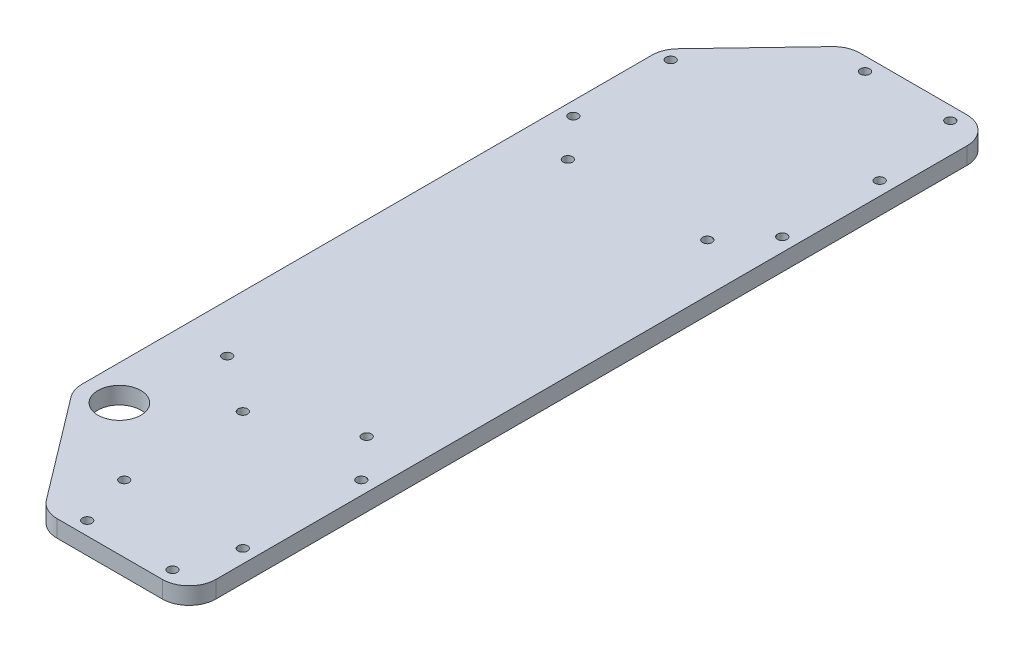
ISO-10303-21;
HEADER;
FILE_DESCRIPTION(('STEP AP214'),'2;1');
FILE_NAME('part.step','',(''),(''),'','','');
FILE_SCHEMA(('AUTOMOTIVE_DESIGN { 1 0 10303 214 1 1 1 1 }'));
ENDSEC;
DATA;
#1=APPLICATION_CONTEXT('core data for automotive mechanical design processes');
#2=APPLICATION_PROTOCOL_DEFINITION('international standard','automotive_design',2000,#1);
#3=PRODUCT_CONTEXT('',#1,'mechanical');
#4=PRODUCT('Part','Part','',(#3));
#5=PRODUCT_RELATED_PRODUCT_CATEGORY('part','',(#4));
#6=PRODUCT_DEFINITION_FORMATION('','',#4);
#7=PRODUCT_DEFINITION_CONTEXT('part definition',#1,'design');
#8=PRODUCT_DEFINITION('design','',#6,#7);
#9=PRODUCT_DEFINITION_SHAPE('','',#8);
#10=(LENGTH_UNIT() NAMED_UNIT(*) SI_UNIT(.MILLI.,.METRE.));
#11=(NAMED_UNIT(*) PLANE_ANGLE_UNIT() SI_UNIT($,.RADIAN.));
#12=(NAMED_UNIT(*) SI_UNIT($,.STERADIAN.) SOLID_ANGLE_UNIT());
#13=UNCERTAINTY_MEASURE_WITH_UNIT(LENGTH_MEASURE(1.E-05),#10,'distance_accuracy_value','');
#14=(GEOMETRIC_REPRESENTATION_CONTEXT(3) GLOBAL_UNCERTAINTY_ASSIGNED_CONTEXT((#13)) GLOBAL_UNIT_ASSIGNED_CONTEXT((#10,
#11,#12)) REPRESENTATION_CONTEXT('',''));
#15=CARTESIAN_POINT('',(0.,0.,0.));
#16=DIRECTION('',(0.,0.,1.));
#17=DIRECTION('',(1.,0.,0.));
#18=AXIS2_PLACEMENT_3D('',#15,#16,#17);
#19=CARTESIAN_POINT('',(0.,6.35,-300.));
#20=DIRECTION('',(0.,0.,-1.));
#21=DIRECTION('',(-1.,0.,0.));
#22=AXIS2_PLACEMENT_3D('',#19,#20,#21);
#23=PLANE('',#22);
#24=DIRECTION('',(1.,0.,0.));
#25=VECTOR('',#24,1.);
#26=CARTESIAN_POINT('',(0.,0.,-300.));
#27=LINE('',#26,#25);
#28=CARTESIAN_POINT('',(38.0848455550211,0.,-300.));
#29=VERTEX_POINT('',#28);
#30=CARTESIAN_POINT('',(78.,0.,-300.));
#31=VERTEX_POINT('',#30);
#32=EDGE_CURVE('E161',#29,#31,#27,.T.);
#33=ORIENTED_EDGE('',*,*,#32,.F.);
#34=DIRECTION('',(0.,-1.,0.));
#35=VECTOR('',#34,1.);
#36=CARTESIAN_POINT('',(38.0848455550211,6.35,-300.));
#37=LINE('',#36,#35);
#38=CARTESIAN_POINT('',(38.0848455550211,6.35,-300.));
#39=VERTEX_POINT('',#38);
#40=EDGE_CURVE('E136',#29,#39,#37,.F.);
#41=ORIENTED_EDGE('',*,*,#40,.T.);
#42=DIRECTION('',(1.,0.,0.));
#43=VECTOR('',#42,1.);
#44=CARTESIAN_POINT('',(0.,6.35,-300.));
#45=LINE('',#44,#43);
#46=CARTESIAN_POINT('',(78.,6.35,-300.));
#47=VERTEX_POINT('',#46);
#48=EDGE_CURVE('E446',#39,#47,#45,.T.);
#49=ORIENTED_EDGE('',*,*,#48,.T.);
#50=DIRECTION('',(0.,-1.,0.));
#51=VECTOR('',#50,1.);
#52=CARTESIAN_POINT('',(78.,0.,-300.));
#53=LINE('',#52,#51);
#54=EDGE_CURVE('E142',#47,#31,#53,.T.);
#55=ORIENTED_EDGE('',*,*,#54,.T.);
#56=EDGE_LOOP('',(#33,#41,#49,#55));
#57=FACE_BOUND('',#56,.T.);
#58=ADVANCED_FACE('F40',(#57),#23,.T.);
#59=CARTESIAN_POINT('',(-132.104836842493,6.35,-125.851116018708));
#60=DIRECTION('',(0.724036688648535,0.,0.689761461297211));
#61=DIRECTION('',(0.689761461297211,0.,-0.724036688648535));
#62=AXIS2_PLACEMENT_3D('',#59,#60,#61);
#63=PLANE('',#62);
#64=DIRECTION('',(-0.689761461297211,0.,0.724036688648535));
#65=VECTOR('',#64,1.);
#66=CARTESIAN_POINT('',(-132.104836842493,6.35,-125.851116018708));
#67=LINE('',#66,#65);
#68=CARTESIAN_POINT('',(30.8444786685357,6.35,-296.897614612972));
#69=VERTEX_POINT('',#68);
#70=CARTESIAN_POINT('',(2.75963311351465,6.35,-267.417193166084));
#71=VERTEX_POINT('',#70);
#72=EDGE_CURVE('E152',#69,#71,#67,.T.);
#73=ORIENTED_EDGE('',*,*,#72,.F.);
#74=DIRECTION('',(0.,-1.,0.));
#75=VECTOR('',#74,1.);
#76=CARTESIAN_POINT('',(30.8444786685357,0.,-296.897614612972));
#77=LINE('',#76,#75);
#78=CARTESIAN_POINT('',(30.8444786685357,0.,-296.897614612972));
#79=VERTEX_POINT('',#78);
#80=EDGE_CURVE('E135',#69,#79,#77,.T.);
#81=ORIENTED_EDGE('',*,*,#80,.T.);
#82=DIRECTION('',(-0.689761461297211,0.,0.724036688648535));
#83=VECTOR('',#82,1.);
#84=CARTESIAN_POINT('',(-132.104836842493,0.,-125.851116018708));
#85=LINE('',#84,#83);
#86=CARTESIAN_POINT('',(2.75963311351465,0.,-267.417193166084));
#87=VERTEX_POINT('',#86);
#88=EDGE_CURVE('E149',#79,#87,#85,.T.);
#89=ORIENTED_EDGE('',*,*,#88,.T.);
#90=DIRECTION('',(0.,-1.,0.));
#91=VECTOR('',#90,1.);
#92=CARTESIAN_POINT('',(2.75963311351465,6.35,-267.417193166084));
#93=LINE('',#92,#91);
#94=EDGE_CURVE('E155',#87,#71,#93,.F.);
#95=ORIENTED_EDGE('',*,*,#94,.T.);
#96=EDGE_LOOP('',(#73,#81,#89,#95));
#97=FACE_BOUND('',#96,.T.);
#98=ADVANCED_FACE('F148',(#97),#63,.F.);
#99=CARTESIAN_POINT('',(0.,6.35,0.));
#100=DIRECTION('',(-1.,0.,0.));
#101=DIRECTION('',(0.,0.,1.));
#102=AXIS2_PLACEMENT_3D('',#99,#100,#101);
#103=PLANE('',#102);
#104=DIRECTION('',(0.,0.,-1.));
#105=VECTOR('',#104,1.);
#106=CARTESIAN_POINT('',(0.,6.35,0.));
#107=LINE('',#106,#105);
#108=CARTESIAN_POINT('',(0.,6.35,-47.9922495753838));
#109=VERTEX_POINT('',#108);
#110=CARTESIAN_POINT('',(0.,6.35,-260.519578553112));
#111=VERTEX_POINT('',#110);
#112=EDGE_CURVE('E267',#109,#111,#107,.T.);
#113=ORIENTED_EDGE('',*,*,#112,.T.);
#114=DIRECTION('',(0.,-1.,0.));
#115=VECTOR('',#114,1.);
#116=CARTESIAN_POINT('',(0.,0.,-260.519578553112));
#117=LINE('',#116,#115);
#118=CARTESIAN_POINT('',(0.,0.,-260.519578553112));
#119=VERTEX_POINT('',#118);
#120=EDGE_CURVE('E223',#111,#119,#117,.T.);
#121=ORIENTED_EDGE('',*,*,#120,.T.);
#122=DIRECTION('',(0.,0.,-1.));
#123=VECTOR('',#122,1.);
#124=CARTESIAN_POINT('',(0.,0.,0.));
#125=LINE('',#124,#123);
#126=CARTESIAN_POINT('',(0.,0.,-47.9922495753838));
#127=VERTEX_POINT('',#126);
#128=EDGE_CURVE('E160',#127,#119,#125,.T.);
#129=ORIENTED_EDGE('',*,*,#128,.F.);
#130=DIRECTION('',(0.,-1.,0.));
#131=VECTOR('',#130,1.);
#132=CARTESIAN_POINT('',(0.,6.35,-47.9922495753838));
#133=LINE('',#132,#131);
#134=EDGE_CURVE('E220',#127,#109,#133,.F.);
#135=ORIENTED_EDGE('',*,*,#134,.T.);
#136=EDGE_LOOP('',(#113,#121,#129,#135));
#137=FACE_BOUND('',#136,.T.);
#138=ADVANCED_FACE('F359',(#137),#103,.T.);
#139=CARTESIAN_POINT('',(21.481023492821,6.35,-16.267274626016));
#140=DIRECTION('',(-0.797203386490908,0.,0.603710825285937));
#141=DIRECTION('',(0.603710825285937,0.,0.797203386490908));
#142=AXIS2_PLACEMENT_3D('',#139,#140,#141);
#143=PLANE('',#142);
#144=DIRECTION('',(-0.603710825285937,0.,-0.797203386490908));
#145=VECTOR('',#144,1.);
#146=CARTESIAN_POINT('',(21.481023492821,0.,-16.267274626016));
#147=LINE('',#146,#145);
#148=CARTESIAN_POINT('',(30.7989582486396,0.,-3.96289174714063));
#149=VERTEX_POINT('',#148);
#150=CARTESIAN_POINT('',(2.02796613509092,0.,-41.9551413225245));
#151=VERTEX_POINT('',#150);
#152=EDGE_CURVE('E165',#149,#151,#147,.T.);
#153=ORIENTED_EDGE('',*,*,#152,.F.);
#154=DIRECTION('',(0.,-1.,0.));
#155=VECTOR('',#154,1.);
#156=CARTESIAN_POINT('',(30.7989582486396,6.35,-3.96289174714063));
#157=LINE('',#156,#155);
#158=CARTESIAN_POINT('',(30.7989582486396,6.35,-3.96289174714063));
#159=VERTEX_POINT('',#158);
#160=EDGE_CURVE('E11',#149,#159,#157,.F.);
#161=ORIENTED_EDGE('',*,*,#160,.T.);
#162=DIRECTION('',(-0.603710825285937,0.,-0.797203386490908));
#163=VECTOR('',#162,1.);
#164=CARTESIAN_POINT('',(21.481023492821,6.35,-16.267274626016));
#165=LINE('',#164,#163);
#166=CARTESIAN_POINT('',(2.02796613509092,6.35,-41.9551413225245));
#167=VERTEX_POINT('',#166);
#168=EDGE_CURVE('E248',#159,#167,#165,.T.);
#169=ORIENTED_EDGE('',*,*,#168,.T.);
#170=DIRECTION('',(0.,-1.,0.));
#171=VECTOR('',#170,1.);
#172=CARTESIAN_POINT('',(2.02796613509092,6.35,-41.9551413225245));
#173=LINE('',#172,#171);
#174=EDGE_CURVE('E49',#167,#151,#173,.T.);
#175=ORIENTED_EDGE('',*,*,#174,.T.);
#176=EDGE_LOOP('',(#153,#161,#169,#175));
#177=FACE_BOUND('',#176,.T.);
#178=ADVANCED_FACE('F245',(#177),#143,.T.);
#179=CARTESIAN_POINT('',(0.,6.35,0.));
#180=DIRECTION('',(0.,0.,-1.));
#181=DIRECTION('',(-1.,0.,0.));
#182=AXIS2_PLACEMENT_3D('',#179,#180,#181);
#183=PLANE('',#182);
#184=DIRECTION('',(1.,0.,0.));
#185=VECTOR('',#184,1.);
#186=CARTESIAN_POINT('',(0.,0.,0.));
#187=LINE('',#186,#185);
#188=CARTESIAN_POINT('',(38.7709921135487,0.,0.));
#189=VERTEX_POINT('',#188);
#190=CARTESIAN_POINT('',(78.,0.,0.));
#191=VERTEX_POINT('',#190);
#192=EDGE_CURVE('E174',#189,#191,#187,.T.);
#193=ORIENTED_EDGE('',*,*,#192,.T.);
#194=DIRECTION('',(0.,-1.,0.));
#195=VECTOR('',#194,1.);
#196=CARTESIAN_POINT('',(78.,6.35,0.));
#197=LINE('',#196,#195);
#198=CARTESIAN_POINT('',(78.,6.35,0.));
#199=VERTEX_POINT('',#198);
#200=EDGE_CURVE('E237',#191,#199,#197,.F.);
#201=ORIENTED_EDGE('',*,*,#200,.T.);
#202=DIRECTION('',(1.,0.,0.));
#203=VECTOR('',#202,1.);
#204=CARTESIAN_POINT('',(0.,6.35,0.));
#205=LINE('',#204,#203);
#206=CARTESIAN_POINT('',(38.7709921135487,6.35,0.));
#207=VERTEX_POINT('',#206);
#208=EDGE_CURVE('E261',#207,#199,#205,.T.);
#209=ORIENTED_EDGE('',*,*,#208,.F.);
#210=DIRECTION('',(0.,-1.,0.));
#211=VECTOR('',#210,1.);
#212=CARTESIAN_POINT('',(38.7709921135487,0.,0.));
#213=LINE('',#212,#211);
#214=EDGE_CURVE('E233',#207,#189,#213,.T.);
#215=ORIENTED_EDGE('',*,*,#214,.T.);
#216=EDGE_LOOP('',(#193,#201,#209,#215));
#217=FACE_BOUND('',#216,.T.);
#218=ADVANCED_FACE('F259',(#217),#183,.F.);
#219=CARTESIAN_POINT('',(18.,6.35,-211.2));
#220=DIRECTION('',(0.,-1.,0.));
#221=DIRECTION('',(0.,0.,-1.));
#222=AXIS2_PLACEMENT_3D('',#219,#220,#221);
#223=CYLINDRICAL_SURFACE('',#222,1.75);
#224=CARTESIAN_POINT('',(18.,6.35,-211.2));
#225=DIRECTION('',(0.,1.,0.));
#226=DIRECTION('',(0.,0.,1.));
#227=AXIS2_PLACEMENT_3D('',#224,#225,#226);
#228=CIRCLE('',#227,1.75);
#229=CARTESIAN_POINT('',(18.,6.35,-209.45));
#230=VERTEX_POINT('',#229);
#231=EDGE_CURVE('E443',#230,#230,#228,.T.);
#232=ORIENTED_EDGE('',*,*,#231,.T.);
#233=EDGE_LOOP('',(#232));
#234=FACE_BOUND('',#233,.T.);
#235=CARTESIAN_POINT('',(18.,0.,-211.2));
#236=DIRECTION('',(0.,1.,0.));
#237=DIRECTION('',(0.,0.,1.));
#238=AXIS2_PLACEMENT_3D('',#235,#236,#237);
#239=CIRCLE('',#238,1.75);
#240=CARTESIAN_POINT('',(18.,0.,-209.45));
#241=VERTEX_POINT('',#240);
#242=EDGE_CURVE('E167',#241,#241,#239,.T.);
#243=ORIENTED_EDGE('',*,*,#242,.F.);
#244=EDGE_LOOP('',(#243));
#245=FACE_BOUND('',#244,.T.);
#246=ADVANCED_FACE('F339',(#234,#245),#223,.F.);
#247=CARTESIAN_POINT('',(70.,6.35,-84.2));
#248=DIRECTION('',(0.,-1.,0.));
#249=DIRECTION('',(0.,0.,-1.));
#250=AXIS2_PLACEMENT_3D('',#247,#248,#249);
#251=CYLINDRICAL_SURFACE('',#250,1.75);
#252=CARTESIAN_POINT('',(70.,6.35,-84.2));
#253=DIRECTION('',(0.,1.,0.));
#254=DIRECTION('',(0.,0.,1.));
#255=AXIS2_PLACEMENT_3D('',#252,#253,#254);
#256=CIRCLE('',#255,1.75);
#257=CARTESIAN_POINT('',(70.,6.35,-82.45));
#258=VERTEX_POINT('',#257);
#259=EDGE_CURVE('E441',#258,#258,#256,.T.);
#260=ORIENTED_EDGE('',*,*,#259,.T.);
#261=EDGE_LOOP('',(#260));
#262=FACE_BOUND('',#261,.T.);
#263=CARTESIAN_POINT('',(70.,0.,-84.2));
#264=DIRECTION('',(0.,1.,0.));
#265=DIRECTION('',(0.,0.,1.));
#266=AXIS2_PLACEMENT_3D('',#263,#264,#265);
#267=CIRCLE('',#266,1.75);
#268=CARTESIAN_POINT('',(70.,0.,-82.45));
#269=VERTEX_POINT('',#268);
#270=EDGE_CURVE('E331',#269,#269,#267,.T.);
#271=ORIENTED_EDGE('',*,*,#270,.F.);
#272=EDGE_LOOP('',(#271));
#273=FACE_BOUND('',#272,.T.);
#274=ADVANCED_FACE('F341',(#262,#273),#251,.F.);
#275=CARTESIAN_POINT('',(18.,6.35,-84.2));
#276=DIRECTION('',(0.,-1.,0.));
#277=DIRECTION('',(0.,0.,-1.));
#278=AXIS2_PLACEMENT_3D('',#275,#276,#277);
#279=CYLINDRICAL_SURFACE('',#278,1.75);
#280=CARTESIAN_POINT('',(18.,6.35,-84.2));
#281=DIRECTION('',(0.,1.,0.));
#282=DIRECTION('',(0.,0.,1.));
#283=AXIS2_PLACEMENT_3D('',#280,#281,#282);
#284=CIRCLE('',#283,1.75);
#285=CARTESIAN_POINT('',(18.,6.35,-82.45));
#286=VERTEX_POINT('',#285);
#287=EDGE_CURVE('E437',#286,#286,#284,.T.);
#288=ORIENTED_EDGE('',*,*,#287,.T.);
#289=EDGE_LOOP('',(#288));
#290=FACE_BOUND('',#289,.T.);
#291=CARTESIAN_POINT('',(18.,0.,-84.2));
#292=DIRECTION('',(0.,1.,0.));
#293=DIRECTION('',(0.,0.,1.));
#294=AXIS2_PLACEMENT_3D('',#291,#292,#293);
#295=CIRCLE('',#294,1.75);
#296=CARTESIAN_POINT('',(18.,0.,-82.45));
#297=VERTEX_POINT('',#296);
#298=EDGE_CURVE('E327',#297,#297,#295,.T.);
#299=ORIENTED_EDGE('',*,*,#298,.F.);
#300=EDGE_LOOP('',(#299));
#301=FACE_BOUND('',#300,.T.);
#302=ADVANCED_FACE('F348',(#290,#301),#279,.F.);
#303=CARTESIAN_POINT('',(70.,6.35,-211.2));
#304=DIRECTION('',(0.,-1.,0.));
#305=DIRECTION('',(0.,0.,-1.));
#306=AXIS2_PLACEMENT_3D('',#303,#304,#305);
#307=CYLINDRICAL_SURFACE('',#306,1.75);
#308=CARTESIAN_POINT('',(70.,6.35,-211.2));
#309=DIRECTION('',(0.,1.,0.));
#310=DIRECTION('',(0.,0.,1.));
#311=AXIS2_PLACEMENT_3D('',#308,#309,#310);
#312=CIRCLE('',#311,1.75);
#313=CARTESIAN_POINT('',(70.,6.35,-209.45));
#314=VERTEX_POINT('',#313);
#315=EDGE_CURVE('E433',#314,#314,#312,.T.);
#316=ORIENTED_EDGE('',*,*,#315,.T.);
#317=EDGE_LOOP('',(#316));
#318=FACE_BOUND('',#317,.T.);
#319=CARTESIAN_POINT('',(70.,0.,-211.2));
#320=DIRECTION('',(0.,1.,0.));
#321=DIRECTION('',(0.,0.,1.));
#322=AXIS2_PLACEMENT_3D('',#319,#320,#321);
#323=CIRCLE('',#322,1.75);
#324=CARTESIAN_POINT('',(70.,0.,-209.45));
#325=VERTEX_POINT('',#324);
#326=EDGE_CURVE('E323',#325,#325,#323,.T.);
#327=ORIENTED_EDGE('',*,*,#326,.F.);
#328=EDGE_LOOP('',(#327));
#329=FACE_BOUND('',#328,.T.);
#330=ADVANCED_FACE('F684',(#318,#329),#307,.F.);
#331=CARTESIAN_POINT('',(5.05,6.35,-262.5));
#332=DIRECTION('',(0.,-1.,0.));
#333=DIRECTION('',(0.,0.,-1.));
#334=AXIS2_PLACEMENT_3D('',#331,#332,#333);
#335=CYLINDRICAL_SURFACE('',#334,1.75);
#336=CARTESIAN_POINT('',(5.05,6.35,-262.5));
#337=DIRECTION('',(0.,1.,0.));
#338=DIRECTION('',(0.,0.,1.));
#339=AXIS2_PLACEMENT_3D('',#336,#337,#338);
#340=CIRCLE('',#339,1.75);
#341=CARTESIAN_POINT('',(5.05,6.35,-260.75));
#342=VERTEX_POINT('',#341);
#343=EDGE_CURVE('E429',#342,#342,#340,.T.);
#344=ORIENTED_EDGE('',*,*,#343,.T.);
#345=EDGE_LOOP('',(#344));
#346=FACE_BOUND('',#345,.T.);
#347=CARTESIAN_POINT('',(5.05,0.,-262.5));
#348=DIRECTION('',(0.,1.,0.));
#349=DIRECTION('',(0.,0.,1.));
#350=AXIS2_PLACEMENT_3D('',#347,#348,#349);
#351=CIRCLE('',#350,1.75);
#352=CARTESIAN_POINT('',(5.05,0.,-260.75));
#353=VERTEX_POINT('',#352);
#354=EDGE_CURVE('E319',#353,#353,#351,.T.);
#355=ORIENTED_EDGE('',*,*,#354,.F.);
#356=EDGE_LOOP('',(#355));
#357=FACE_BOUND('',#356,.T.);
#358=ADVANCED_FACE('F674',(#346,#357),#335,.F.);
#359=CARTESIAN_POINT('',(5.05,6.35,-226.2));
#360=DIRECTION('',(0.,-1.,0.));
#361=DIRECTION('',(0.,0.,-1.));
#362=AXIS2_PLACEMENT_3D('',#359,#360,#361);
#363=CYLINDRICAL_SURFACE('',#362,1.75);
#364=CARTESIAN_POINT('',(5.05,6.35,-226.2));
#365=DIRECTION('',(0.,1.,0.));
#366=DIRECTION('',(0.,0.,1.));
#367=AXIS2_PLACEMENT_3D('',#364,#365,#366);
#368=CIRCLE('',#367,1.75);
#369=CARTESIAN_POINT('',(5.05,6.35,-224.45));
#370=VERTEX_POINT('',#369);
#371=EDGE_CURVE('E425',#370,#370,#368,.T.);
#372=ORIENTED_EDGE('',*,*,#371,.T.);
#373=EDGE_LOOP('',(#372));
#374=FACE_BOUND('',#373,.T.);
#375=CARTESIAN_POINT('',(5.05,0.,-226.2));
#376=DIRECTION('',(0.,1.,0.));
#377=DIRECTION('',(0.,0.,1.));
#378=AXIS2_PLACEMENT_3D('',#375,#376,#377);
#379=CIRCLE('',#378,1.75);
#380=CARTESIAN_POINT('',(5.05,0.,-224.45));
#381=VERTEX_POINT('',#380);
#382=EDGE_CURVE('E315',#381,#381,#379,.T.);
#383=ORIENTED_EDGE('',*,*,#382,.F.);
#384=EDGE_LOOP('',(#383));
#385=FACE_BOUND('',#384,.T.);
#386=ADVANCED_FACE('F664',(#374,#385),#363,.F.);
#387=CARTESIAN_POINT('',(82.95,6.35,-226.2));
#388=DIRECTION('',(0.,-1.,0.));
#389=DIRECTION('',(0.,0.,-1.));
#390=AXIS2_PLACEMENT_3D('',#387,#388,#389);
#391=CYLINDRICAL_SURFACE('',#390,1.75);
#392=CARTESIAN_POINT('',(82.95,6.35,-226.2));
#393=DIRECTION('',(0.,1.,0.));
#394=DIRECTION('',(0.,0.,1.));
#395=AXIS2_PLACEMENT_3D('',#392,#393,#394);
#396=CIRCLE('',#395,1.75);
#397=CARTESIAN_POINT('',(82.95,6.35,-224.45));
#398=VERTEX_POINT('',#397);
#399=EDGE_CURVE('E421',#398,#398,#396,.T.);
#400=ORIENTED_EDGE('',*,*,#399,.T.);
#401=EDGE_LOOP('',(#400));
#402=FACE_BOUND('',#401,.T.);
#403=CARTESIAN_POINT('',(82.95,0.,-226.2));
#404=DIRECTION('',(0.,1.,0.));
#405=DIRECTION('',(0.,0.,1.));
#406=AXIS2_PLACEMENT_3D('',#403,#404,#405);
#407=CIRCLE('',#406,1.75);
#408=CARTESIAN_POINT('',(82.95,0.,-224.45));
#409=VERTEX_POINT('',#408);
#410=EDGE_CURVE('E311',#409,#409,#407,.T.);
#411=ORIENTED_EDGE('',*,*,#410,.F.);
#412=EDGE_LOOP('',(#411));
#413=FACE_BOUND('',#412,.T.);
#414=ADVANCED_FACE('F654',(#402,#413),#391,.F.);
#415=CARTESIAN_POINT('',(82.95,6.35,-262.5));
#416=DIRECTION('',(0.,-1.,0.));
#417=DIRECTION('',(0.,0.,-1.));
#418=AXIS2_PLACEMENT_3D('',#415,#416,#417);
#419=CYLINDRICAL_SURFACE('',#418,1.75);
#420=CARTESIAN_POINT('',(82.95,6.35,-262.5));
#421=DIRECTION('',(0.,1.,0.));
#422=DIRECTION('',(0.,0.,1.));
#423=AXIS2_PLACEMENT_3D('',#420,#421,#422);
#424=CIRCLE('',#423,1.75);
#425=CARTESIAN_POINT('',(82.95,6.35,-260.75));
#426=VERTEX_POINT('',#425);
#427=EDGE_CURVE('E417',#426,#426,#424,.T.);
#428=ORIENTED_EDGE('',*,*,#427,.T.);
#429=EDGE_LOOP('',(#428));
#430=FACE_BOUND('',#429,.T.);
#431=CARTESIAN_POINT('',(82.95,0.,-262.5));
#432=DIRECTION('',(0.,1.,0.));
#433=DIRECTION('',(0.,0.,1.));
#434=AXIS2_PLACEMENT_3D('',#431,#432,#433);
#435=CIRCLE('',#434,1.75);
#436=CARTESIAN_POINT('',(82.95,0.,-260.75));
#437=VERTEX_POINT('',#436);
#438=EDGE_CURVE('E307',#437,#437,#435,.T.);
#439=ORIENTED_EDGE('',*,*,#438,.F.);
#440=EDGE_LOOP('',(#439));
#441=FACE_BOUND('',#440,.T.);
#442=ADVANCED_FACE('F644',(#430,#441),#419,.F.);
#443=CARTESIAN_POINT('',(38.8,6.35,-69.2));
#444=DIRECTION('',(0.,-1.,0.));
#445=DIRECTION('',(0.,0.,-1.));
#446=AXIS2_PLACEMENT_3D('',#443,#444,#445);
#447=CYLINDRICAL_SURFACE('',#446,1.75);
#448=CARTESIAN_POINT('',(38.8,6.35,-69.2));
#449=DIRECTION('',(0.,1.,0.));
#450=DIRECTION('',(0.,0.,1.));
#451=AXIS2_PLACEMENT_3D('',#448,#449,#450);
#452=CIRCLE('',#451,1.75);
#453=CARTESIAN_POINT('',(38.8,6.35,-67.45));
#454=VERTEX_POINT('',#453);
#455=EDGE_CURVE('E413',#454,#454,#452,.T.);
#456=ORIENTED_EDGE('',*,*,#455,.T.);
#457=EDGE_LOOP('',(#456));
#458=FACE_BOUND('',#457,.T.);
#459=CARTESIAN_POINT('',(38.8,0.,-69.2));
#460=DIRECTION('',(0.,1.,0.));
#461=DIRECTION('',(0.,0.,1.));
#462=AXIS2_PLACEMENT_3D('',#459,#460,#461);
#463=CIRCLE('',#462,1.75);
#464=CARTESIAN_POINT('',(38.8,0.,-67.45));
#465=VERTEX_POINT('',#464);
#466=EDGE_CURVE('E303',#465,#465,#463,.T.);
#467=ORIENTED_EDGE('',*,*,#466,.F.);
#468=EDGE_LOOP('',(#467));
#469=FACE_BOUND('',#468,.T.);
#470=ADVANCED_FACE('F634',(#458,#469),#447,.F.);
#471=CARTESIAN_POINT('',(83.,6.35,-69.2));
#472=DIRECTION('',(0.,-1.,0.));
#473=DIRECTION('',(0.,0.,-1.));
#474=AXIS2_PLACEMENT_3D('',#471,#472,#473);
#475=CYLINDRICAL_SURFACE('',#474,1.75);
#476=CARTESIAN_POINT('',(83.,6.35,-69.2));
#477=DIRECTION('',(0.,1.,0.));
#478=DIRECTION('',(0.,0.,1.));
#479=AXIS2_PLACEMENT_3D('',#476,#477,#478);
#480=CIRCLE('',#479,1.75);
#481=CARTESIAN_POINT('',(83.,6.35,-67.45));
#482=VERTEX_POINT('',#481);
#483=EDGE_CURVE('E409',#482,#482,#480,.T.);
#484=ORIENTED_EDGE('',*,*,#483,.T.);
#485=EDGE_LOOP('',(#484));
#486=FACE_BOUND('',#485,.T.);
#487=CARTESIAN_POINT('',(83.,0.,-69.2));
#488=DIRECTION('',(0.,1.,0.));
#489=DIRECTION('',(0.,0.,1.));
#490=AXIS2_PLACEMENT_3D('',#487,#488,#489);
#491=CIRCLE('',#490,1.75);
#492=CARTESIAN_POINT('',(83.,0.,-67.45));
#493=VERTEX_POINT('',#492);
#494=EDGE_CURVE('E299',#493,#493,#491,.T.);
#495=ORIENTED_EDGE('',*,*,#494,.F.);
#496=EDGE_LOOP('',(#495));
#497=FACE_BOUND('',#496,.T.);
#498=ADVANCED_FACE('F624',(#486,#497),#475,.F.);
#499=CARTESIAN_POINT('',(83.,6.35,-25.));
#500=DIRECTION('',(0.,-1.,0.));
#501=DIRECTION('',(0.,0.,-1.));
#502=AXIS2_PLACEMENT_3D('',#499,#500,#501);
#503=CYLINDRICAL_SURFACE('',#502,1.74999999999998);
#504=CARTESIAN_POINT('',(83.,6.35,-25.));
#505=DIRECTION('',(0.,1.,0.));
#506=DIRECTION('',(0.,0.,1.));
#507=AXIS2_PLACEMENT_3D('',#504,#505,#506);
#508=CIRCLE('',#507,1.74999999999998);
#509=CARTESIAN_POINT('',(83.,6.35,-23.25));
#510=VERTEX_POINT('',#509);
#511=EDGE_CURVE('E405',#510,#510,#508,.T.);
#512=ORIENTED_EDGE('',*,*,#511,.T.);
#513=EDGE_LOOP('',(#512));
#514=FACE_BOUND('',#513,.T.);
#515=CARTESIAN_POINT('',(83.,0.,-25.));
#516=DIRECTION('',(0.,1.,0.));
#517=DIRECTION('',(0.,0.,1.));
#518=AXIS2_PLACEMENT_3D('',#515,#516,#517);
#519=CIRCLE('',#518,1.74999999999998);
#520=CARTESIAN_POINT('',(83.,0.,-23.25));
#521=VERTEX_POINT('',#520);
#522=EDGE_CURVE('E295',#521,#521,#519,.T.);
#523=ORIENTED_EDGE('',*,*,#522,.F.);
#524=EDGE_LOOP('',(#523));
#525=FACE_BOUND('',#524,.T.);
#526=ADVANCED_FACE('F614',(#514,#525),#503,.F.);
#527=CARTESIAN_POINT('',(38.8,6.35,-25.));
#528=DIRECTION('',(0.,-1.,0.));
#529=DIRECTION('',(0.,0.,-1.));
#530=AXIS2_PLACEMENT_3D('',#527,#528,#529);
#531=CYLINDRICAL_SURFACE('',#530,1.75000000000001);
#532=CARTESIAN_POINT('',(38.8,6.35,-25.));
#533=DIRECTION('',(0.,1.,0.));
#534=DIRECTION('',(0.,0.,1.));
#535=AXIS2_PLACEMENT_3D('',#532,#533,#534);
#536=CIRCLE('',#535,1.75000000000001);
#537=CARTESIAN_POINT('',(38.8,6.35,-23.25));
#538=VERTEX_POINT('',#537);
#539=EDGE_CURVE('E401',#538,#538,#536,.T.);
#540=ORIENTED_EDGE('',*,*,#539,.T.);
#541=EDGE_LOOP('',(#540));
#542=FACE_BOUND('',#541,.T.);
#543=CARTESIAN_POINT('',(38.8,0.,-25.));
#544=DIRECTION('',(0.,1.,0.));
#545=DIRECTION('',(0.,0.,1.));
#546=AXIS2_PLACEMENT_3D('',#543,#544,#545);
#547=CIRCLE('',#546,1.75000000000001);
#548=CARTESIAN_POINT('',(38.8,0.,-23.25));
#549=VERTEX_POINT('',#548);
#550=EDGE_CURVE('E291',#549,#549,#547,.T.);
#551=ORIENTED_EDGE('',*,*,#550,.F.);
#552=EDGE_LOOP('',(#551));
#553=FACE_BOUND('',#552,.T.);
#554=ADVANCED_FACE('F604',(#542,#553),#531,.F.);
#555=CARTESIAN_POINT('',(45.,6.35,-295.));
#556=DIRECTION('',(0.,-1.,0.));
#557=DIRECTION('',(0.,0.,-1.));
#558=AXIS2_PLACEMENT_3D('',#555,#556,#557);
#559=CYLINDRICAL_SURFACE('',#558,1.75);
#560=CARTESIAN_POINT('',(45.,6.35,-295.));
#561=DIRECTION('',(0.,1.,0.));
#562=DIRECTION('',(0.,0.,1.));
#563=AXIS2_PLACEMENT_3D('',#560,#561,#562);
#564=CIRCLE('',#563,1.75);
#565=CARTESIAN_POINT('',(45.,6.35,-293.25));
#566=VERTEX_POINT('',#565);
#567=EDGE_CURVE('E397',#566,#566,#564,.T.);
#568=ORIENTED_EDGE('',*,*,#567,.T.);
#569=EDGE_LOOP('',(#568));
#570=FACE_BOUND('',#569,.T.);
#571=CARTESIAN_POINT('',(45.,0.,-295.));
#572=DIRECTION('',(0.,1.,0.));
#573=DIRECTION('',(0.,0.,1.));
#574=AXIS2_PLACEMENT_3D('',#571,#572,#573);
#575=CIRCLE('',#574,1.75);
#576=CARTESIAN_POINT('',(45.,0.,-293.25));
#577=VERTEX_POINT('',#576);
#578=EDGE_CURVE('E287',#577,#577,#575,.T.);
#579=ORIENTED_EDGE('',*,*,#578,.F.);
#580=EDGE_LOOP('',(#579));
#581=FACE_BOUND('',#580,.T.);
#582=ADVANCED_FACE('F594',(#570,#581),#559,.F.);
#583=CARTESIAN_POINT('',(76.8,6.35,-295.));
#584=DIRECTION('',(0.,-1.,0.));
#585=DIRECTION('',(0.,0.,-1.));
#586=AXIS2_PLACEMENT_3D('',#583,#584,#585);
#587=CYLINDRICAL_SURFACE('',#586,1.75);
#588=CARTESIAN_POINT('',(76.8,6.35,-295.));
#589=DIRECTION('',(0.,1.,0.));
#590=DIRECTION('',(0.,0.,1.));
#591=AXIS2_PLACEMENT_3D('',#588,#589,#590);
#592=CIRCLE('',#591,1.75);
#593=CARTESIAN_POINT('',(76.8,6.35,-293.25));
#594=VERTEX_POINT('',#593);
#595=EDGE_CURVE('E393',#594,#594,#592,.T.);
#596=ORIENTED_EDGE('',*,*,#595,.T.);
#597=EDGE_LOOP('',(#596));
#598=FACE_BOUND('',#597,.T.);
#599=CARTESIAN_POINT('',(76.8,0.,-295.));
#600=DIRECTION('',(0.,1.,0.));
#601=DIRECTION('',(0.,0.,1.));
#602=AXIS2_PLACEMENT_3D('',#599,#600,#601);
#603=CIRCLE('',#602,1.75);
#604=CARTESIAN_POINT('',(76.8,0.,-293.25));
#605=VERTEX_POINT('',#604);
#606=EDGE_CURVE('E283',#605,#605,#603,.T.);
#607=ORIENTED_EDGE('',*,*,#606,.F.);
#608=EDGE_LOOP('',(#607));
#609=FACE_BOUND('',#608,.T.);
#610=ADVANCED_FACE('F584',(#598,#609),#587,.F.);
#611=CARTESIAN_POINT('',(45.,6.35,-5.));
#612=DIRECTION('',(0.,-1.,0.));
#613=DIRECTION('',(0.,0.,-1.));
#614=AXIS2_PLACEMENT_3D('',#611,#612,#613);
#615=CYLINDRICAL_SURFACE('',#614,1.75);
#616=CARTESIAN_POINT('',(45.,6.35,-5.));
#617=DIRECTION('',(0.,1.,0.));
#618=DIRECTION('',(0.,0.,1.));
#619=AXIS2_PLACEMENT_3D('',#616,#617,#618);
#620=CIRCLE('',#619,1.75);
#621=CARTESIAN_POINT('',(45.,6.35,-3.25));
#622=VERTEX_POINT('',#621);
#623=EDGE_CURVE('E389',#622,#622,#620,.T.);
#624=ORIENTED_EDGE('',*,*,#623,.T.);
#625=EDGE_LOOP('',(#624));
#626=FACE_BOUND('',#625,.T.);
#627=CARTESIAN_POINT('',(45.,0.,-5.));
#628=DIRECTION('',(0.,1.,0.));
#629=DIRECTION('',(0.,0.,1.));
#630=AXIS2_PLACEMENT_3D('',#627,#628,#629);
#631=CIRCLE('',#630,1.75);
#632=CARTESIAN_POINT('',(45.,0.,-3.25));
#633=VERTEX_POINT('',#632);
#634=EDGE_CURVE('E279',#633,#633,#631,.T.);
#635=ORIENTED_EDGE('',*,*,#634,.F.);
#636=EDGE_LOOP('',(#635));
#637=FACE_BOUND('',#636,.T.);
#638=ADVANCED_FACE('F574',(#626,#637),#615,.F.);
#639=CARTESIAN_POINT('',(76.8,6.35,-5.));
#640=DIRECTION('',(0.,-1.,0.));
#641=DIRECTION('',(0.,0.,-1.));
#642=AXIS2_PLACEMENT_3D('',#639,#640,#641);
#643=CYLINDRICAL_SURFACE('',#642,1.75);
#644=CARTESIAN_POINT('',(76.8,6.35,-5.));
#645=DIRECTION('',(0.,1.,0.));
#646=DIRECTION('',(0.,0.,1.));
#647=AXIS2_PLACEMENT_3D('',#644,#645,#646);
#648=CIRCLE('',#647,1.75);
#649=CARTESIAN_POINT('',(76.8,6.35,-3.25));
#650=VERTEX_POINT('',#649);
#651=EDGE_CURVE('E385',#650,#650,#648,.T.);
#652=ORIENTED_EDGE('',*,*,#651,.T.);
#653=EDGE_LOOP('',(#652));
#654=FACE_BOUND('',#653,.T.);
#655=CARTESIAN_POINT('',(76.8,0.,-5.));
#656=DIRECTION('',(0.,1.,0.));
#657=DIRECTION('',(0.,0.,1.));
#658=AXIS2_PLACEMENT_3D('',#655,#656,#657);
#659=CIRCLE('',#658,1.75);
#660=CARTESIAN_POINT('',(76.8,0.,-3.25));
#661=VERTEX_POINT('',#660);
#662=EDGE_CURVE('E275',#661,#661,#659,.T.);
#663=ORIENTED_EDGE('',*,*,#662,.F.);
#664=EDGE_LOOP('',(#663));
#665=FACE_BOUND('',#664,.T.);
#666=ADVANCED_FACE('F565',(#654,#665),#643,.F.);
#667=CARTESIAN_POINT('',(13.,6.35,-49.));
#668=DIRECTION('',(0.,-1.,0.));
#669=DIRECTION('',(0.,0.,-1.));
#670=AXIS2_PLACEMENT_3D('',#667,#668,#669);
#671=CYLINDRICAL_SURFACE('',#670,8.);
#672=CARTESIAN_POINT('',(13.,6.35,-49.));
#673=DIRECTION('',(0.,1.,0.));
#674=DIRECTION('',(0.,0.,1.));
#675=AXIS2_PLACEMENT_3D('',#672,#673,#674);
#676=CIRCLE('',#675,8.);
#677=CARTESIAN_POINT('',(13.,6.35,-41.));
#678=VERTEX_POINT('',#677);
#679=EDGE_CURVE('E181',#678,#678,#676,.T.);
#680=ORIENTED_EDGE('',*,*,#679,.T.);
#681=EDGE_LOOP('',(#680));
#682=FACE_BOUND('',#681,.T.);
#683=CARTESIAN_POINT('',(13.,0.,-49.));
#684=DIRECTION('',(0.,1.,0.));
#685=DIRECTION('',(0.,0.,1.));
#686=AXIS2_PLACEMENT_3D('',#683,#684,#685);
#687=CIRCLE('',#686,8.);
#688=CARTESIAN_POINT('',(13.,0.,-41.));
#689=VERTEX_POINT('',#688);
#690=EDGE_CURVE('E271',#689,#689,#687,.T.);
#691=ORIENTED_EDGE('',*,*,#690,.F.);
#692=EDGE_LOOP('',(#691));
#693=FACE_BOUND('',#692,.T.);
#694=ADVANCED_FACE('F371',(#682,#693),#671,.F.);
#695=CARTESIAN_POINT('',(88.,6.35,0.));
#696=DIRECTION('',(-1.,0.,0.));
#697=DIRECTION('',(0.,0.,1.));
#698=AXIS2_PLACEMENT_3D('',#695,#696,#697);
#699=PLANE('',#698);
#700=DIRECTION('',(0.,0.,-1.));
#701=VECTOR('',#700,1.);
#702=CARTESIAN_POINT('',(88.,0.,0.));
#703=LINE('',#702,#701);
#704=CARTESIAN_POINT('',(88.,0.,-10.));
#705=VERTEX_POINT('',#704);
#706=CARTESIAN_POINT('',(88.,0.,-290.));
#707=VERTEX_POINT('',#706);
#708=EDGE_CURVE('E178',#705,#707,#703,.T.);
#709=ORIENTED_EDGE('',*,*,#708,.T.);
#710=DIRECTION('',(0.,-1.,0.));
#711=VECTOR('',#710,1.);
#712=CARTESIAN_POINT('',(88.,6.35,-290.));
#713=LINE('',#712,#711);
#714=CARTESIAN_POINT('',(88.,6.35,-290.));
#715=VERTEX_POINT('',#714);
#716=EDGE_CURVE('E56',#707,#715,#713,.F.);
#717=ORIENTED_EDGE('',*,*,#716,.T.);
#718=DIRECTION('',(0.,0.,-1.));
#719=VECTOR('',#718,1.);
#720=CARTESIAN_POINT('',(88.,6.35,0.));
#721=LINE('',#720,#719);
#722=CARTESIAN_POINT('',(88.,6.35,-10.));
#723=VERTEX_POINT('',#722);
#724=EDGE_CURVE('E183',#723,#715,#721,.T.);
#725=ORIENTED_EDGE('',*,*,#724,.F.);
#726=DIRECTION('',(0.,-1.,0.));
#727=VECTOR('',#726,1.);
#728=CARTESIAN_POINT('',(88.,6.35,-10.));
#729=LINE('',#728,#727);
#730=EDGE_CURVE('E227',#723,#705,#729,.T.);
#731=ORIENTED_EDGE('',*,*,#730,.T.);
#732=EDGE_LOOP('',(#709,#717,#725,#731));
#733=FACE_BOUND('',#732,.T.);
#734=ADVANCED_FACE('F367',(#733),#699,.F.);
#735=CARTESIAN_POINT('',(0.,6.35,0.));
#736=DIRECTION('',(0.,1.,0.));
#737=DIRECTION('',(0.,0.,1.));
#738=AXIS2_PLACEMENT_3D('',#735,#736,#737);
#739=PLANE('',#738);
#740=ORIENTED_EDGE('',*,*,#679,.F.);
#741=EDGE_LOOP('',(#740));
#742=FACE_BOUND('',#741,.T.);
#743=ORIENTED_EDGE('',*,*,#651,.F.);
#744=EDGE_LOOP('',(#743));
#745=FACE_BOUND('',#744,.T.);
#746=ORIENTED_EDGE('',*,*,#623,.F.);
#747=EDGE_LOOP('',(#746));
#748=FACE_BOUND('',#747,.T.);
#749=ORIENTED_EDGE('',*,*,#595,.F.);
#750=EDGE_LOOP('',(#749));
#751=FACE_BOUND('',#750,.T.);
#752=ORIENTED_EDGE('',*,*,#567,.F.);
#753=EDGE_LOOP('',(#752));
#754=FACE_BOUND('',#753,.T.);
#755=ORIENTED_EDGE('',*,*,#539,.F.);
#756=EDGE_LOOP('',(#755));
#757=FACE_BOUND('',#756,.T.);
#758=ORIENTED_EDGE('',*,*,#511,.F.);
#759=EDGE_LOOP('',(#758));
#760=FACE_BOUND('',#759,.T.);
#761=ORIENTED_EDGE('',*,*,#483,.F.);
#762=EDGE_LOOP('',(#761));
#763=FACE_BOUND('',#762,.T.);
#764=ORIENTED_EDGE('',*,*,#455,.F.);
#765=EDGE_LOOP('',(#764));
#766=FACE_BOUND('',#765,.T.);
#767=ORIENTED_EDGE('',*,*,#427,.F.);
#768=EDGE_LOOP('',(#767));
#769=FACE_BOUND('',#768,.T.);
#770=ORIENTED_EDGE('',*,*,#399,.F.);
#771=EDGE_LOOP('',(#770));
#772=FACE_BOUND('',#771,.T.);
#773=ORIENTED_EDGE('',*,*,#371,.F.);
#774=EDGE_LOOP('',(#773));
#775=FACE_BOUND('',#774,.T.);
#776=ORIENTED_EDGE('',*,*,#343,.F.);
#777=EDGE_LOOP('',(#776));
#778=FACE_BOUND('',#777,.T.);
#779=ORIENTED_EDGE('',*,*,#315,.F.);
#780=EDGE_LOOP('',(#779));
#781=FACE_BOUND('',#780,.T.);
#782=ORIENTED_EDGE('',*,*,#287,.F.);
#783=EDGE_LOOP('',(#782));
#784=FACE_BOUND('',#783,.T.);
#785=ORIENTED_EDGE('',*,*,#259,.F.);
#786=EDGE_LOOP('',(#785));
#787=FACE_BOUND('',#786,.T.);
#788=ORIENTED_EDGE('',*,*,#231,.F.);
#789=EDGE_LOOP('',(#788));
#790=FACE_BOUND('',#789,.T.);
#791=ORIENTED_EDGE('',*,*,#48,.F.);
#792=CARTESIAN_POINT('',(38.0848455550211,6.35,-290.));
#793=DIRECTION('',(0.,1.,0.));
#794=DIRECTION('',(0.,0.,1.));
#795=AXIS2_PLACEMENT_3D('',#792,#793,#794);
#796=CIRCLE('',#795,10.);
#797=EDGE_CURVE('E217',#39,#69,#796,.T.);
#798=ORIENTED_EDGE('',*,*,#797,.T.);
#799=ORIENTED_EDGE('',*,*,#72,.T.);
#800=CARTESIAN_POINT('',(10.,6.35,-260.519578553112));
#801=DIRECTION('',(0.,1.,0.));
#802=DIRECTION('',(0.,0.,1.));
#803=AXIS2_PLACEMENT_3D('',#800,#801,#802);
#804=CIRCLE('',#803,10.);
#805=EDGE_CURVE('E214',#71,#111,#804,.T.);
#806=ORIENTED_EDGE('',*,*,#805,.T.);
#807=ORIENTED_EDGE('',*,*,#112,.F.);
#808=CARTESIAN_POINT('',(10.,6.35,-47.9922495753838));
#809=DIRECTION('',(0.,1.,0.));
#810=DIRECTION('',(0.,0.,1.));
#811=AXIS2_PLACEMENT_3D('',#808,#809,#810);
#812=CIRCLE('',#811,10.);
#813=EDGE_CURVE('E203',#109,#167,#812,.T.);
#814=ORIENTED_EDGE('',*,*,#813,.T.);
#815=ORIENTED_EDGE('',*,*,#168,.F.);
#816=CARTESIAN_POINT('',(38.7709921135487,6.35,-10.));
#817=DIRECTION('',(0.,1.,0.));
#818=DIRECTION('',(0.,0.,1.));
#819=AXIS2_PLACEMENT_3D('',#816,#817,#818);
#820=CIRCLE('',#819,10.);
#821=EDGE_CURVE('E206',#159,#207,#820,.T.);
#822=ORIENTED_EDGE('',*,*,#821,.T.);
#823=ORIENTED_EDGE('',*,*,#208,.T.);
#824=CARTESIAN_POINT('',(78.,6.35,-10.));
#825=DIRECTION('',(0.,1.,0.));
#826=DIRECTION('',(0.,0.,1.));
#827=AXIS2_PLACEMENT_3D('',#824,#825,#826);
#828=CIRCLE('',#827,10.);
#829=EDGE_CURVE('E63',#199,#723,#828,.T.);
#830=ORIENTED_EDGE('',*,*,#829,.T.);
#831=ORIENTED_EDGE('',*,*,#724,.T.);
#832=CARTESIAN_POINT('',(78.,6.35,-290.));
#833=DIRECTION('',(0.,1.,0.));
#834=DIRECTION('',(0.,0.,1.));
#835=AXIS2_PLACEMENT_3D('',#832,#833,#834);
#836=CIRCLE('',#835,10.);
#837=EDGE_CURVE('E211',#715,#47,#836,.T.);
#838=ORIENTED_EDGE('',*,*,#837,.T.);
#839=EDGE_LOOP('',(#791,#798,#799,#806,#807,#814,#815,#822,#823,#830,#831,#838));
#840=FACE_BOUND('',#839,.T.);
#841=ADVANCED_FACE('F370',(#742,#745,#748,#751,#754,#757,#760,#763,#766,#769,#772,#775,#778,
#781,#784,#787,#790,#840),#739,.T.);
#842=CARTESIAN_POINT('',(0.,0.,0.));
#843=DIRECTION('',(0.,1.,0.));
#844=DIRECTION('',(0.,0.,1.));
#845=AXIS2_PLACEMENT_3D('',#842,#843,#844);
#846=PLANE('',#845);
#847=ORIENTED_EDGE('',*,*,#690,.T.);
#848=EDGE_LOOP('',(#847));
#849=FACE_BOUND('',#848,.T.);
#850=ORIENTED_EDGE('',*,*,#662,.T.);
#851=EDGE_LOOP('',(#850));
#852=FACE_BOUND('',#851,.T.);
#853=ORIENTED_EDGE('',*,*,#634,.T.);
#854=EDGE_LOOP('',(#853));
#855=FACE_BOUND('',#854,.T.);
#856=ORIENTED_EDGE('',*,*,#606,.T.);
#857=EDGE_LOOP('',(#856));
#858=FACE_BOUND('',#857,.T.);
#859=ORIENTED_EDGE('',*,*,#578,.T.);
#860=EDGE_LOOP('',(#859));
#861=FACE_BOUND('',#860,.T.);
#862=ORIENTED_EDGE('',*,*,#550,.T.);
#863=EDGE_LOOP('',(#862));
#864=FACE_BOUND('',#863,.T.);
#865=ORIENTED_EDGE('',*,*,#522,.T.);
#866=EDGE_LOOP('',(#865));
#867=FACE_BOUND('',#866,.T.);
#868=ORIENTED_EDGE('',*,*,#494,.T.);
#869=EDGE_LOOP('',(#868));
#870=FACE_BOUND('',#869,.T.);
#871=ORIENTED_EDGE('',*,*,#466,.T.);
#872=EDGE_LOOP('',(#871));
#873=FACE_BOUND('',#872,.T.);
#874=ORIENTED_EDGE('',*,*,#438,.T.);
#875=EDGE_LOOP('',(#874));
#876=FACE_BOUND('',#875,.T.);
#877=ORIENTED_EDGE('',*,*,#410,.T.);
#878=EDGE_LOOP('',(#877));
#879=FACE_BOUND('',#878,.T.);
#880=ORIENTED_EDGE('',*,*,#382,.T.);
#881=EDGE_LOOP('',(#880));
#882=FACE_BOUND('',#881,.T.);
#883=ORIENTED_EDGE('',*,*,#354,.T.);
#884=EDGE_LOOP('',(#883));
#885=FACE_BOUND('',#884,.T.);
#886=ORIENTED_EDGE('',*,*,#326,.T.);
#887=EDGE_LOOP('',(#886));
#888=FACE_BOUND('',#887,.T.);
#889=ORIENTED_EDGE('',*,*,#298,.T.);
#890=EDGE_LOOP('',(#889));
#891=FACE_BOUND('',#890,.T.);
#892=ORIENTED_EDGE('',*,*,#270,.T.);
#893=EDGE_LOOP('',(#892));
#894=FACE_BOUND('',#893,.T.);
#895=ORIENTED_EDGE('',*,*,#242,.T.);
#896=EDGE_LOOP('',(#895));
#897=FACE_BOUND('',#896,.T.);
#898=ORIENTED_EDGE('',*,*,#88,.F.);
#899=CARTESIAN_POINT('',(38.0848455550211,0.,-290.));
#900=DIRECTION('',(0.,1.,0.));
#901=DIRECTION('',(0.,0.,1.));
#902=AXIS2_PLACEMENT_3D('',#899,#900,#901);
#903=CIRCLE('',#902,10.);
#904=EDGE_CURVE('E131',#79,#29,#903,.F.);
#905=ORIENTED_EDGE('',*,*,#904,.T.);
#906=ORIENTED_EDGE('',*,*,#32,.T.);
#907=CARTESIAN_POINT('',(78.,0.,-290.));
#908=DIRECTION('',(0.,1.,0.));
#909=DIRECTION('',(0.,0.,1.));
#910=AXIS2_PLACEMENT_3D('',#907,#908,#909);
#911=CIRCLE('',#910,10.);
#912=EDGE_CURVE('E193',#31,#707,#911,.F.);
#913=ORIENTED_EDGE('',*,*,#912,.T.);
#914=ORIENTED_EDGE('',*,*,#708,.F.);
#915=CARTESIAN_POINT('',(78.,0.,-10.));
#916=DIRECTION('',(0.,1.,0.));
#917=DIRECTION('',(0.,0.,1.));
#918=AXIS2_PLACEMENT_3D('',#915,#916,#917);
#919=CIRCLE('',#918,10.);
#920=EDGE_CURVE('E190',#705,#191,#919,.F.);
#921=ORIENTED_EDGE('',*,*,#920,.T.);
#922=ORIENTED_EDGE('',*,*,#192,.F.);
#923=CARTESIAN_POINT('',(38.7709921135487,0.,-10.));
#924=DIRECTION('',(0.,1.,0.));
#925=DIRECTION('',(0.,0.,1.));
#926=AXIS2_PLACEMENT_3D('',#923,#924,#925);
#927=CIRCLE('',#926,10.);
#928=EDGE_CURVE('E187',#189,#149,#927,.F.);
#929=ORIENTED_EDGE('',*,*,#928,.T.);
#930=ORIENTED_EDGE('',*,*,#152,.T.);
#931=CARTESIAN_POINT('',(10.,0.,-47.9922495753838));
#932=DIRECTION('',(0.,1.,0.));
#933=DIRECTION('',(0.,0.,1.));
#934=AXIS2_PLACEMENT_3D('',#931,#932,#933);
#935=CIRCLE('',#934,10.);
#936=EDGE_CURVE('E154',#151,#127,#935,.F.);
#937=ORIENTED_EDGE('',*,*,#936,.T.);
#938=ORIENTED_EDGE('',*,*,#128,.T.);
#939=CARTESIAN_POINT('',(10.,0.,-260.519578553112));
#940=DIRECTION('',(0.,1.,0.));
#941=DIRECTION('',(0.,0.,1.));
#942=AXIS2_PLACEMENT_3D('',#939,#940,#941);
#943=CIRCLE('',#942,10.);
#944=EDGE_CURVE('E143',#119,#87,#943,.F.);
#945=ORIENTED_EDGE('',*,*,#944,.T.);
#946=EDGE_LOOP('',(#898,#905,#906,#913,#914,#921,#922,#929,#930,#937,#938,#945));
#947=FACE_BOUND('',#946,.T.);
#948=ADVANCED_FACE('F157',(#849,#852,#855,#858,#861,#864,#867,#870,#873,#876,#879,#882,#885,
#888,#891,#894,#897,#947),#846,.F.);
#949=CARTESIAN_POINT('',(38.0848455550211,6.35,-290.));
#950=DIRECTION('',(0.,1.,0.));
#951=DIRECTION('',(0.,0.,1.));
#952=AXIS2_PLACEMENT_3D('',#949,#950,#951);
#953=CYLINDRICAL_SURFACE('',#952,10.);
#954=ORIENTED_EDGE('',*,*,#797,.F.);
#955=ORIENTED_EDGE('',*,*,#40,.F.);
#956=ORIENTED_EDGE('',*,*,#904,.F.);
#957=ORIENTED_EDGE('',*,*,#80,.F.);
#958=EDGE_LOOP('',(#954,#955,#956,#957));
#959=FACE_BOUND('',#958,.T.);
#960=ADVANCED_FACE('F134',(#959),#953,.T.);
#961=CARTESIAN_POINT('',(10.,6.35,-260.519578553112));
#962=DIRECTION('',(0.,1.,0.));
#963=DIRECTION('',(0.,0.,1.));
#964=AXIS2_PLACEMENT_3D('',#961,#962,#963);
#965=CYLINDRICAL_SURFACE('',#964,10.);
#966=ORIENTED_EDGE('',*,*,#805,.F.);
#967=ORIENTED_EDGE('',*,*,#94,.F.);
#968=ORIENTED_EDGE('',*,*,#944,.F.);
#969=ORIENTED_EDGE('',*,*,#120,.F.);
#970=EDGE_LOOP('',(#966,#967,#968,#969));
#971=FACE_BOUND('',#970,.T.);
#972=ADVANCED_FACE('F463',(#971),#965,.T.);
#973=CARTESIAN_POINT('',(78.,6.35,-290.));
#974=DIRECTION('',(0.,1.,0.));
#975=DIRECTION('',(0.,0.,1.));
#976=AXIS2_PLACEMENT_3D('',#973,#974,#975);
#977=CYLINDRICAL_SURFACE('',#976,10.);
#978=ORIENTED_EDGE('',*,*,#837,.F.);
#979=ORIENTED_EDGE('',*,*,#716,.F.);
#980=ORIENTED_EDGE('',*,*,#912,.F.);
#981=ORIENTED_EDGE('',*,*,#54,.F.);
#982=EDGE_LOOP('',(#978,#979,#980,#981));
#983=FACE_BOUND('',#982,.T.);
#984=ADVANCED_FACE('F465',(#983),#977,.T.);
#985=CARTESIAN_POINT('',(78.,6.35,-10.));
#986=DIRECTION('',(0.,-1.,0.));
#987=DIRECTION('',(0.,0.,-1.));
#988=AXIS2_PLACEMENT_3D('',#985,#986,#987);
#989=CYLINDRICAL_SURFACE('',#988,10.);
#990=ORIENTED_EDGE('',*,*,#829,.F.);
#991=ORIENTED_EDGE('',*,*,#200,.F.);
#992=ORIENTED_EDGE('',*,*,#920,.F.);
#993=ORIENTED_EDGE('',*,*,#730,.F.);
#994=EDGE_LOOP('',(#990,#991,#992,#993));
#995=FACE_BOUND('',#994,.T.);
#996=ADVANCED_FACE('F471',(#995),#989,.T.);
#997=CARTESIAN_POINT('',(38.7709921135487,6.35,-10.));
#998=DIRECTION('',(0.,1.,0.));
#999=DIRECTION('',(0.,0.,1.));
#1000=AXIS2_PLACEMENT_3D('',#997,#998,#999);
#1001=CYLINDRICAL_SURFACE('',#1000,10.);
#1002=ORIENTED_EDGE('',*,*,#821,.F.);
#1003=ORIENTED_EDGE('',*,*,#160,.F.);
#1004=ORIENTED_EDGE('',*,*,#928,.F.);
#1005=ORIENTED_EDGE('',*,*,#214,.F.);
#1006=EDGE_LOOP('',(#1002,#1003,#1004,#1005));
#1007=FACE_BOUND('',#1006,.T.);
#1008=ADVANCED_FACE('F256',(#1007),#1001,.T.);
#1009=CARTESIAN_POINT('',(10.,6.35,-47.9922495753838));
#1010=DIRECTION('',(0.,-1.,0.));
#1011=DIRECTION('',(0.,0.,-1.));
#1012=AXIS2_PLACEMENT_3D('',#1009,#1010,#1011);
#1013=CYLINDRICAL_SURFACE('',#1012,10.);
#1014=ORIENTED_EDGE('',*,*,#813,.F.);
#1015=ORIENTED_EDGE('',*,*,#134,.F.);
#1016=ORIENTED_EDGE('',*,*,#936,.F.);
#1017=ORIENTED_EDGE('',*,*,#174,.F.);
#1018=EDGE_LOOP('',(#1014,#1015,#1016,#1017));
#1019=FACE_BOUND('',#1018,.T.);
#1020=ADVANCED_FACE('F42',(#1019),#1013,.T.);
#1021=CLOSED_SHELL('',(#58,#98,#138,#178,#218,#246,#274,#302,#330,#358,#386,#414,#442,#470,#498,
#526,#554,#582,#610,#638,#666,#694,#734,#841,#948,#960,#972,#984,#996,#1008,#1020));
#1022=MANIFOLD_SOLID_BREP('B2',#1021);
#1023=ADVANCED_BREP_SHAPE_REPRESENTATION('',(#18,#1022),#14);
#1024=SHAPE_DEFINITION_REPRESENTATION(#9,#1023);
ENDSEC;
END-ISO-10303-21;
